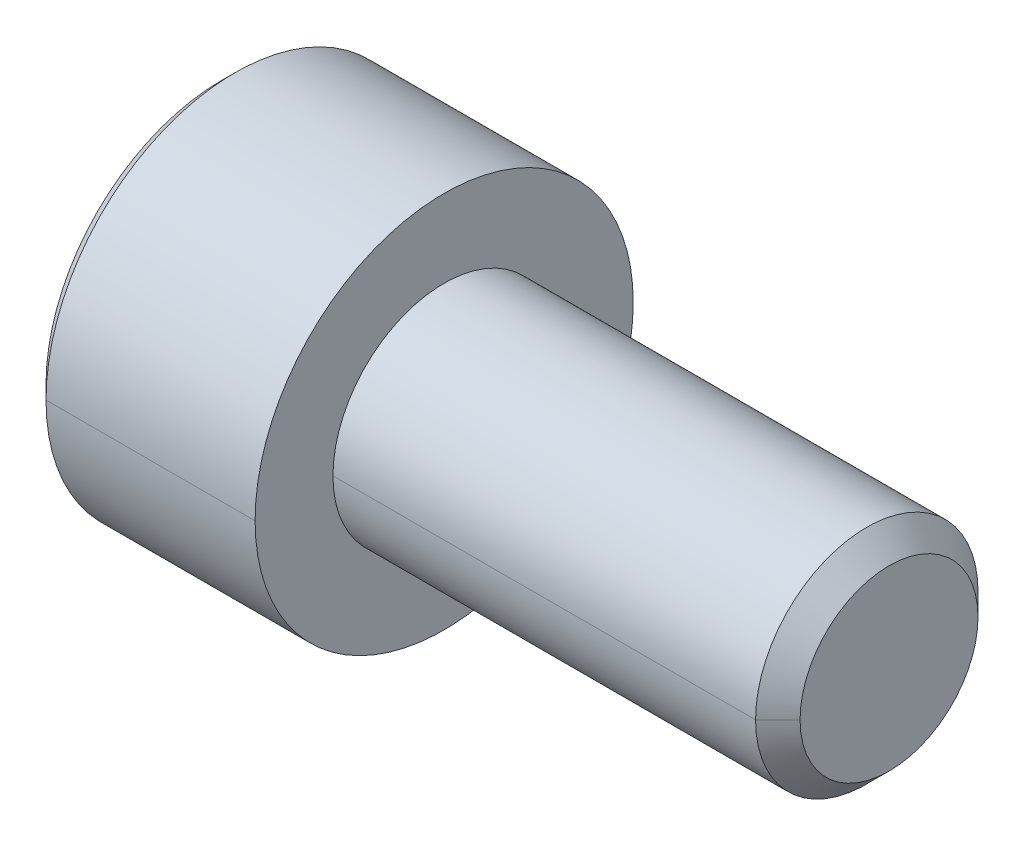
ISO-10303-21;
HEADER;
FILE_DESCRIPTION(('STEP AP214'),'2;1');
FILE_NAME('part.step','',(''),(''),'','','');
FILE_SCHEMA(('AUTOMOTIVE_DESIGN { 1 0 10303 214 1 1 1 1 }'));
ENDSEC;
DATA;
#1=APPLICATION_CONTEXT('core data for automotive mechanical design processes');
#2=APPLICATION_PROTOCOL_DEFINITION('international standard','automotive_design',2000,#1);
#3=PRODUCT_CONTEXT('',#1,'mechanical');
#4=PRODUCT('Part','Part','',(#3));
#5=PRODUCT_RELATED_PRODUCT_CATEGORY('part','',(#4));
#6=PRODUCT_DEFINITION_FORMATION('','',#4);
#7=PRODUCT_DEFINITION_CONTEXT('part definition',#1,'design');
#8=PRODUCT_DEFINITION('design','',#6,#7);
#9=PRODUCT_DEFINITION_SHAPE('','',#8);
#10=(LENGTH_UNIT() NAMED_UNIT(*) SI_UNIT(.MILLI.,.METRE.));
#11=(NAMED_UNIT(*) PLANE_ANGLE_UNIT() SI_UNIT($,.RADIAN.));
#12=(NAMED_UNIT(*) SI_UNIT($,.STERADIAN.) SOLID_ANGLE_UNIT());
#13=UNCERTAINTY_MEASURE_WITH_UNIT(LENGTH_MEASURE(1.E-05),#10,'distance_accuracy_value','');
#14=(GEOMETRIC_REPRESENTATION_CONTEXT(3) GLOBAL_UNCERTAINTY_ASSIGNED_CONTEXT((#13)) GLOBAL_UNIT_ASSIGNED_CONTEXT((#10,
#11,#12)) REPRESENTATION_CONTEXT('',''));
#15=CARTESIAN_POINT('',(0.,0.,0.));
#16=DIRECTION('',(0.,0.,1.));
#17=DIRECTION('',(1.,0.,0.));
#18=AXIS2_PLACEMENT_3D('',#15,#16,#17);
#19=CARTESIAN_POINT('',(-9.2,3.98371685740842,2.3));
#20=DIRECTION('',(0.894427190999916,-0.387298334620742,-0.223606797749979));
#21=DIRECTION('',(0.,0.5,-0.866025403784439));
#22=AXIS2_PLACEMENT_3D('',#19,#20,#21);
#23=PLANE('',#22);
#24=DIRECTION('',(0.397359707119513,0.458831467741124,0.794719414239026));
#25=VECTOR('',#24,1.);
#26=CARTESIAN_POINT('',(-12.5,-1.15470053837925,-2.));
#27=LINE('',#26,#25);
#28=CARTESIAN_POINT('',(-12.5,-1.15470053837925,-2.));
#29=VERTEX_POINT('',#28);
#30=CARTESIAN_POINT('',(-11.5,0.,0.));
#31=VERTEX_POINT('',#30);
#32=EDGE_CURVE('E244',#29,#31,#27,.T.);
#33=ORIENTED_EDGE('',*,*,#32,.F.);
#34=CARTESIAN_POINT('',(-12.5,-1.15470053837925,-2.));
#35=CARTESIAN_POINT('',(-12.5,-1.539600717839,-1.33333333333333));
#36=CARTESIAN_POINT('',(-12.5,-1.92450089729875,-0.666666666666667));
#37=CARTESIAN_POINT('',(-12.5,-2.30940107675851,0.));
#38=(BOUNDED_CURVE() B_SPLINE_CURVE(3,(#34,#35,#36,#37),.UNSPECIFIED.,.F.,
.F.) B_SPLINE_CURVE_WITH_KNOTS((4,4),(0.,1.),
.UNSPECIFIED.) CURVE() GEOMETRIC_REPRESENTATION_ITEM() RATIONAL_B_SPLINE_CURVE((1.,1.,1.,1.)) REPRESENTATION_ITEM(''));
#39=CARTESIAN_POINT('',(-12.5,-2.30940107675851,0.));
#40=VERTEX_POINT('',#39);
#41=EDGE_CURVE('E203',#29,#40,#38,.T.);
#42=ORIENTED_EDGE('',*,*,#41,.T.);
#43=DIRECTION('',(0.397359707119513,0.917662935482247,0.));
#44=VECTOR('',#43,1.);
#45=CARTESIAN_POINT('',(-12.5,-2.30940107675851,0.));
#46=LINE('',#45,#44);
#47=EDGE_CURVE('E10',#40,#31,#46,.T.);
#48=ORIENTED_EDGE('',*,*,#47,.T.);
#49=EDGE_LOOP('',(#33,#42,#48));
#50=FACE_BOUND('',#49,.T.);
#51=ADVANCED_FACE('F16',(#50),#23,.F.);
#52=CARTESIAN_POINT('',(-9.2,3.98371685740842,-2.3));
#53=DIRECTION('',(0.894427190999916,-0.387298334620742,0.223606797749978));
#54=DIRECTION('',(0.,-0.5,-0.866025403784439));
#55=AXIS2_PLACEMENT_3D('',#52,#53,#54);
#56=PLANE('',#55);
#57=ORIENTED_EDGE('',*,*,#47,.F.);
#58=CARTESIAN_POINT('',(-12.5,-2.30940107675851,0.));
#59=CARTESIAN_POINT('',(-12.5,-1.92450089729875,0.666666666666666));
#60=CARTESIAN_POINT('',(-12.5,-1.53960071783901,1.33333333333333));
#61=CARTESIAN_POINT('',(-12.5,-1.15470053837925,2.));
#62=(BOUNDED_CURVE() B_SPLINE_CURVE(3,(#58,#59,#60,#61),.UNSPECIFIED.,.F.,
.F.) B_SPLINE_CURVE_WITH_KNOTS((4,4),(0.,1.),
.UNSPECIFIED.) CURVE() GEOMETRIC_REPRESENTATION_ITEM() RATIONAL_B_SPLINE_CURVE((1.,1.,1.,1.)) REPRESENTATION_ITEM(''));
#63=CARTESIAN_POINT('',(-12.5,-1.15470053837925,2.));
#64=VERTEX_POINT('',#63);
#65=EDGE_CURVE('E204',#40,#64,#62,.T.);
#66=ORIENTED_EDGE('',*,*,#65,.T.);
#67=DIRECTION('',(0.397359707119513,0.458831467741124,-0.794719414239026));
#68=VECTOR('',#67,1.);
#69=CARTESIAN_POINT('',(-12.5,-1.15470053837925,2.));
#70=LINE('',#69,#68);
#71=EDGE_CURVE('E27',#64,#31,#70,.T.);
#72=ORIENTED_EDGE('',*,*,#71,.T.);
#73=EDGE_LOOP('',(#57,#66,#72));
#74=FACE_BOUND('',#73,.T.);
#75=ADVANCED_FACE('F352',(#74),#56,.F.);
#76=CARTESIAN_POINT('',(-9.2,0.,-4.6));
#77=DIRECTION('',(0.894427190999916,0.,0.447213595499958));
#78=DIRECTION('',(0.,-1.,0.));
#79=AXIS2_PLACEMENT_3D('',#76,#77,#78);
#80=PLANE('',#79);
#81=ORIENTED_EDGE('',*,*,#71,.F.);
#82=CARTESIAN_POINT('',(-12.5,-1.15470053837925,2.));
#83=CARTESIAN_POINT('',(-12.5,-0.384900179459752,2.));
#84=CARTESIAN_POINT('',(-12.5,0.38490017945975,2.));
#85=CARTESIAN_POINT('',(-12.5,1.15470053837925,2.));
#86=(BOUNDED_CURVE() B_SPLINE_CURVE(3,(#82,#83,#84,#85),.UNSPECIFIED.,.F.,
.F.) B_SPLINE_CURVE_WITH_KNOTS((4,4),(0.,1.),
.UNSPECIFIED.) CURVE() GEOMETRIC_REPRESENTATION_ITEM() RATIONAL_B_SPLINE_CURVE((1.,1.,1.,1.)) REPRESENTATION_ITEM(''));
#87=CARTESIAN_POINT('',(-12.5,1.15470053837925,2.));
#88=VERTEX_POINT('',#87);
#89=EDGE_CURVE('E230',#64,#88,#86,.T.);
#90=ORIENTED_EDGE('',*,*,#89,.T.);
#91=DIRECTION('',(0.397359707119513,-0.458831467741124,-0.794719414239026));
#92=VECTOR('',#91,1.);
#93=CARTESIAN_POINT('',(-12.5,1.15470053837925,2.));
#94=LINE('',#93,#92);
#95=EDGE_CURVE('E250',#88,#31,#94,.T.);
#96=ORIENTED_EDGE('',*,*,#95,.T.);
#97=EDGE_LOOP('',(#81,#90,#96));
#98=FACE_BOUND('',#97,.T.);
#99=ADVANCED_FACE('F363',(#98),#80,.F.);
#100=CARTESIAN_POINT('',(-9.2,-3.98371685740842,-2.3));
#101=DIRECTION('',(0.894427190999916,0.387298334620742,0.223606797749979));
#102=DIRECTION('',(0.,0.5,-0.866025403784439));
#103=AXIS2_PLACEMENT_3D('',#100,#101,#102);
#104=PLANE('',#103);
#105=ORIENTED_EDGE('',*,*,#95,.F.);
#106=CARTESIAN_POINT('',(-12.5,1.15470053837925,2.));
#107=CARTESIAN_POINT('',(-12.5,1.539600717839,1.33333333333333));
#108=CARTESIAN_POINT('',(-12.5,1.92450089729875,0.666666666666667));
#109=CARTESIAN_POINT('',(-12.5,2.30940107675851,0.));
#110=(BOUNDED_CURVE() B_SPLINE_CURVE(3,(#106,#107,#108,#109),.UNSPECIFIED.,.F.,
.F.) B_SPLINE_CURVE_WITH_KNOTS((4,4),(0.,1.),
.UNSPECIFIED.) CURVE() GEOMETRIC_REPRESENTATION_ITEM() RATIONAL_B_SPLINE_CURVE((1.,1.,1.,1.)) REPRESENTATION_ITEM(''));
#111=CARTESIAN_POINT('',(-12.5,2.30940107675851,0.));
#112=VERTEX_POINT('',#111);
#113=EDGE_CURVE('E198',#88,#112,#110,.T.);
#114=ORIENTED_EDGE('',*,*,#113,.T.);
#115=DIRECTION('',(0.397359707119513,-0.917662935482247,0.));
#116=VECTOR('',#115,1.);
#117=CARTESIAN_POINT('',(-12.5,2.30940107675851,0.));
#118=LINE('',#117,#116);
#119=EDGE_CURVE('E205',#112,#31,#118,.T.);
#120=ORIENTED_EDGE('',*,*,#119,.T.);
#121=EDGE_LOOP('',(#105,#114,#120));
#122=FACE_BOUND('',#121,.T.);
#123=ADVANCED_FACE('F699',(#122),#104,.F.);
#124=CARTESIAN_POINT('',(-9.2,0.,4.6));
#125=DIRECTION('',(0.894427190999916,0.,-0.447213595499958));
#126=DIRECTION('',(0.,-1.,0.));
#127=AXIS2_PLACEMENT_3D('',#124,#125,#126);
#128=PLANE('',#127);
#129=DIRECTION('',(0.397359707119513,-0.458831467741124,0.794719414239026));
#130=VECTOR('',#129,1.);
#131=CARTESIAN_POINT('',(-12.5,1.15470053837925,-2.));
#132=LINE('',#131,#130);
#133=CARTESIAN_POINT('',(-12.5,1.15470053837925,-2.));
#134=VERTEX_POINT('',#133);
#135=EDGE_CURVE('E209',#134,#31,#132,.T.);
#136=ORIENTED_EDGE('',*,*,#135,.F.);
#137=CARTESIAN_POINT('',(-12.5,1.15470053837925,-2.));
#138=CARTESIAN_POINT('',(-12.5,0.384900179459751,-2.));
#139=CARTESIAN_POINT('',(-12.5,-0.384900179459751,-2.));
#140=CARTESIAN_POINT('',(-12.5,-1.15470053837925,-2.));
#141=(BOUNDED_CURVE() B_SPLINE_CURVE(3,(#137,#138,#139,#140),.UNSPECIFIED.,.F.,
.F.) B_SPLINE_CURVE_WITH_KNOTS((4,4),(0.,1.),
.UNSPECIFIED.) CURVE() GEOMETRIC_REPRESENTATION_ITEM() RATIONAL_B_SPLINE_CURVE((1.,1.,1.,1.)) REPRESENTATION_ITEM(''));
#142=EDGE_CURVE('E263',#134,#29,#141,.T.);
#143=ORIENTED_EDGE('',*,*,#142,.T.);
#144=ORIENTED_EDGE('',*,*,#32,.T.);
#145=EDGE_LOOP('',(#136,#143,#144));
#146=FACE_BOUND('',#145,.T.);
#147=ADVANCED_FACE('F694',(#146),#128,.F.);
#148=CARTESIAN_POINT('',(-9.2,-3.98371685740842,2.3));
#149=DIRECTION('',(0.894427190999916,0.387298334620742,-0.223606797749979));
#150=DIRECTION('',(0.,-0.5,-0.866025403784439));
#151=AXIS2_PLACEMENT_3D('',#148,#149,#150);
#152=PLANE('',#151);
#153=ORIENTED_EDGE('',*,*,#119,.F.);
#154=CARTESIAN_POINT('',(-12.5,2.30940107675851,0.));
#155=CARTESIAN_POINT('',(-12.5,1.92450089729875,-0.666666666666667));
#156=CARTESIAN_POINT('',(-12.5,1.539600717839,-1.33333333333333));
#157=CARTESIAN_POINT('',(-12.5,1.15470053837925,-2.));
#158=(BOUNDED_CURVE() B_SPLINE_CURVE(3,(#154,#155,#156,#157),.UNSPECIFIED.,.F.,
.F.) B_SPLINE_CURVE_WITH_KNOTS((4,4),(0.,1.),
.UNSPECIFIED.) CURVE() GEOMETRIC_REPRESENTATION_ITEM() RATIONAL_B_SPLINE_CURVE((1.,1.,1.,1.)) REPRESENTATION_ITEM(''));
#159=EDGE_CURVE('E210',#112,#134,#158,.T.);
#160=ORIENTED_EDGE('',*,*,#159,.T.);
#161=ORIENTED_EDGE('',*,*,#135,.T.);
#162=EDGE_LOOP('',(#153,#160,#161));
#163=FACE_BOUND('',#162,.T.);
#164=ADVANCED_FACE('F698',(#163),#152,.F.);
#165=CARTESIAN_POINT('',(-15.,0.,0.));
#166=DIRECTION('',(1.,0.,0.));
#167=DIRECTION('',(0.,0.,-1.));
#168=AXIS2_PLACEMENT_3D('',#165,#166,#167);
#169=CONICAL_SURFACE('',#168,3.95,0.785398163397446);
#170=DIRECTION('',(0.70710678118655,0.,0.707106781186546));
#171=VECTOR('',#170,1.);
#172=CARTESIAN_POINT('',(-15.,0.,3.95));
#173=LINE('',#172,#171);
#174=CARTESIAN_POINT('',(-15.,0.,3.95));
#175=VERTEX_POINT('',#174);
#176=CARTESIAN_POINT('',(-14.7,0.,4.25));
#177=VERTEX_POINT('',#176);
#178=EDGE_CURVE('E217',#175,#177,#173,.T.);
#179=ORIENTED_EDGE('',*,*,#178,.F.);
#180=CARTESIAN_POINT('',(-15.,0.,0.));
#181=DIRECTION('',(-1.,0.,0.));
#182=DIRECTION('',(0.,0.,-1.));
#183=AXIS2_PLACEMENT_3D('',#180,#181,#182);
#184=CIRCLE('',#183,3.95);
#185=CARTESIAN_POINT('',(-15.,0.,-3.95));
#186=VERTEX_POINT('',#185);
#187=EDGE_CURVE('E191',#186,#175,#184,.T.);
#188=ORIENTED_EDGE('',*,*,#187,.F.);
#189=DIRECTION('',(0.70710678118655,0.,-0.707106781186546));
#190=VECTOR('',#189,1.);
#191=CARTESIAN_POINT('',(-15.,0.,-3.95));
#192=LINE('',#191,#190);
#193=CARTESIAN_POINT('',(-14.7,0.,-4.25));
#194=VERTEX_POINT('',#193);
#195=EDGE_CURVE('E186',#186,#194,#192,.T.);
#196=ORIENTED_EDGE('',*,*,#195,.T.);
#197=CARTESIAN_POINT('',(-14.7,0.,0.));
#198=DIRECTION('',(1.,0.,0.));
#199=DIRECTION('',(0.,0.,-1.));
#200=AXIS2_PLACEMENT_3D('',#197,#198,#199);
#201=CIRCLE('',#200,4.25);
#202=EDGE_CURVE('E118',#177,#194,#201,.T.);
#203=ORIENTED_EDGE('',*,*,#202,.F.);
#204=EDGE_LOOP('',(#179,#188,#196,#203));
#205=FACE_BOUND('',#204,.T.);
#206=ADVANCED_FACE('F609',(#205),#169,.T.);
#207=CARTESIAN_POINT('',(-12.5,2.30940107675851,0.));
#208=DIRECTION('',(0.,0.866025403784439,-0.5));
#209=DIRECTION('',(-1.,0.,0.));
#210=AXIS2_PLACEMENT_3D('',#207,#208,#209);
#211=PLANE('',#210);
#212=DIRECTION('',(0.,-0.5,-0.866025403784439));
#213=VECTOR('',#212,1.);
#214=CARTESIAN_POINT('',(-15.,2.30940107675851,0.));
#215=LINE('',#214,#213);
#216=CARTESIAN_POINT('',(-15.,2.30940107675851,0.));
#217=VERTEX_POINT('',#216);
#218=CARTESIAN_POINT('',(-15.,1.15470053837925,-2.));
#219=VERTEX_POINT('',#218);
#220=EDGE_CURVE('E194',#217,#219,#215,.T.);
#221=ORIENTED_EDGE('',*,*,#220,.T.);
#222=DIRECTION('',(-1.,0.,0.));
#223=VECTOR('',#222,1.);
#224=CARTESIAN_POINT('',(-12.5,1.15470053837925,-2.));
#225=LINE('',#224,#223);
#226=EDGE_CURVE('E238',#134,#219,#225,.T.);
#227=ORIENTED_EDGE('',*,*,#226,.F.);
#228=ORIENTED_EDGE('',*,*,#159,.F.);
#229=DIRECTION('',(-1.,0.,0.));
#230=VECTOR('',#229,1.);
#231=CARTESIAN_POINT('',(-12.5,2.30940107675851,0.));
#232=LINE('',#231,#230);
#233=EDGE_CURVE('E195',#112,#217,#232,.T.);
#234=ORIENTED_EDGE('',*,*,#233,.T.);
#235=EDGE_LOOP('',(#221,#227,#228,#234));
#236=FACE_BOUND('',#235,.T.);
#237=ADVANCED_FACE('F604',(#236),#211,.F.);
#238=CARTESIAN_POINT('',(-12.5,1.15470053837925,-2.));
#239=DIRECTION('',(0.,0.,-1.));
#240=DIRECTION('',(0.,-1.,0.));
#241=AXIS2_PLACEMENT_3D('',#238,#239,#240);
#242=PLANE('',#241);
#243=DIRECTION('',(0.,-1.,0.));
#244=VECTOR('',#243,1.);
#245=CARTESIAN_POINT('',(-15.,1.15470053837925,-2.));
#246=LINE('',#245,#244);
#247=CARTESIAN_POINT('',(-15.,-1.15470053837925,-2.));
#248=VERTEX_POINT('',#247);
#249=EDGE_CURVE('E199',#219,#248,#246,.T.);
#250=ORIENTED_EDGE('',*,*,#249,.T.);
#251=DIRECTION('',(-1.,0.,0.));
#252=VECTOR('',#251,1.);
#253=CARTESIAN_POINT('',(-12.5,-1.15470053837925,-2.));
#254=LINE('',#253,#252);
#255=EDGE_CURVE('E259',#29,#248,#254,.T.);
#256=ORIENTED_EDGE('',*,*,#255,.F.);
#257=ORIENTED_EDGE('',*,*,#142,.F.);
#258=ORIENTED_EDGE('',*,*,#226,.T.);
#259=EDGE_LOOP('',(#250,#256,#257,#258));
#260=FACE_BOUND('',#259,.T.);
#261=ADVANCED_FACE('F608',(#260),#242,.F.);
#262=CARTESIAN_POINT('',(-12.5,-1.15470053837925,-2.));
#263=DIRECTION('',(0.,-0.866025403784439,-0.5));
#264=DIRECTION('',(0.,0.5,-0.866025403784439));
#265=AXIS2_PLACEMENT_3D('',#262,#263,#264);
#266=PLANE('',#265);
#267=DIRECTION('',(0.,-0.5,0.866025403784439));
#268=VECTOR('',#267,1.);
#269=CARTESIAN_POINT('',(-15.,-1.15470053837925,-2.));
#270=LINE('',#269,#268);
#271=CARTESIAN_POINT('',(-15.,-2.30940107675851,0.));
#272=VERTEX_POINT('',#271);
#273=EDGE_CURVE('E215',#248,#272,#270,.T.);
#274=ORIENTED_EDGE('',*,*,#273,.T.);
#275=DIRECTION('',(-1.,0.,0.));
#276=VECTOR('',#275,1.);
#277=CARTESIAN_POINT('',(-12.5,-2.30940107675851,0.));
#278=LINE('',#277,#276);
#279=EDGE_CURVE('E200',#40,#272,#278,.T.);
#280=ORIENTED_EDGE('',*,*,#279,.F.);
#281=ORIENTED_EDGE('',*,*,#41,.F.);
#282=ORIENTED_EDGE('',*,*,#255,.T.);
#283=EDGE_LOOP('',(#274,#280,#281,#282));
#284=FACE_BOUND('',#283,.T.);
#285=ADVANCED_FACE('F597',(#284),#266,.F.);
#286=CARTESIAN_POINT('',(-12.5,-2.30940107675851,0.));
#287=DIRECTION('',(0.,-0.866025403784439,0.5));
#288=DIRECTION('',(-1.,0.,0.));
#289=AXIS2_PLACEMENT_3D('',#286,#287,#288);
#290=PLANE('',#289);
#291=DIRECTION('',(0.,0.5,0.866025403784439));
#292=VECTOR('',#291,1.);
#293=CARTESIAN_POINT('',(-15.,-2.30940107675851,0.));
#294=LINE('',#293,#292);
#295=CARTESIAN_POINT('',(-15.,-1.15470053837925,2.));
#296=VERTEX_POINT('',#295);
#297=EDGE_CURVE('E211',#272,#296,#294,.T.);
#298=ORIENTED_EDGE('',*,*,#297,.T.);
#299=DIRECTION('',(-1.,0.,0.));
#300=VECTOR('',#299,1.);
#301=CARTESIAN_POINT('',(-12.5,-1.15470053837925,2.));
#302=LINE('',#301,#300);
#303=EDGE_CURVE('E227',#64,#296,#302,.T.);
#304=ORIENTED_EDGE('',*,*,#303,.F.);
#305=ORIENTED_EDGE('',*,*,#65,.F.);
#306=ORIENTED_EDGE('',*,*,#279,.T.);
#307=EDGE_LOOP('',(#298,#304,#305,#306));
#308=FACE_BOUND('',#307,.T.);
#309=ADVANCED_FACE('F355',(#308),#290,.F.);
#310=CARTESIAN_POINT('',(-12.5,-1.15470053837925,2.));
#311=DIRECTION('',(0.,0.,1.));
#312=DIRECTION('',(0.,-1.,0.));
#313=AXIS2_PLACEMENT_3D('',#310,#311,#312);
#314=PLANE('',#313);
#315=DIRECTION('',(0.,1.,0.));
#316=VECTOR('',#315,1.);
#317=CARTESIAN_POINT('',(-15.,-1.15470053837925,2.));
#318=LINE('',#317,#316);
#319=CARTESIAN_POINT('',(-15.,1.15470053837925,2.));
#320=VERTEX_POINT('',#319);
#321=EDGE_CURVE('E216',#296,#320,#318,.T.);
#322=ORIENTED_EDGE('',*,*,#321,.T.);
#323=DIRECTION('',(-1.,0.,0.));
#324=VECTOR('',#323,1.);
#325=CARTESIAN_POINT('',(-12.5,1.15470053837925,2.));
#326=LINE('',#325,#324);
#327=EDGE_CURVE('E280',#88,#320,#326,.T.);
#328=ORIENTED_EDGE('',*,*,#327,.F.);
#329=ORIENTED_EDGE('',*,*,#89,.F.);
#330=ORIENTED_EDGE('',*,*,#303,.T.);
#331=EDGE_LOOP('',(#322,#328,#329,#330));
#332=FACE_BOUND('',#331,.T.);
#333=ADVANCED_FACE('F360',(#332),#314,.F.);
#334=CARTESIAN_POINT('',(-12.5,1.15470053837925,2.));
#335=DIRECTION('',(0.,0.866025403784439,0.5));
#336=DIRECTION('',(1.,0.,0.));
#337=AXIS2_PLACEMENT_3D('',#334,#335,#336);
#338=PLANE('',#337);
#339=DIRECTION('',(0.,0.5,-0.866025403784439));
#340=VECTOR('',#339,1.);
#341=CARTESIAN_POINT('',(-15.,1.15470053837925,2.));
#342=LINE('',#341,#340);
#343=EDGE_CURVE('E297',#320,#217,#342,.T.);
#344=ORIENTED_EDGE('',*,*,#343,.T.);
#345=ORIENTED_EDGE('',*,*,#233,.F.);
#346=ORIENTED_EDGE('',*,*,#113,.F.);
#347=ORIENTED_EDGE('',*,*,#327,.T.);
#348=EDGE_LOOP('',(#344,#345,#346,#347));
#349=FACE_BOUND('',#348,.T.);
#350=ADVANCED_FACE('F18',(#349),#338,.F.);
#351=CARTESIAN_POINT('',(-0.5,0.,0.));
#352=DIRECTION('',(-1.,0.,0.));
#353=DIRECTION('',(0.,0.,1.));
#354=AXIS2_PLACEMENT_3D('',#351,#352,#353);
#355=CONICAL_SURFACE('',#354,2.5,0.785398163397448);
#356=DIRECTION('',(-0.707106781186548,0.,-0.707106781186548));
#357=VECTOR('',#356,1.);
#358=CARTESIAN_POINT('',(-0.5,0.,-2.5));
#359=LINE('',#358,#357);
#360=CARTESIAN_POINT('',(0.,0.,-2.));
#361=VERTEX_POINT('',#360);
#362=CARTESIAN_POINT('',(-0.5,0.,-2.5));
#363=VERTEX_POINT('',#362);
#364=EDGE_CURVE('E175',#361,#363,#359,.T.);
#365=ORIENTED_EDGE('',*,*,#364,.F.);
#366=CARTESIAN_POINT('',(0.,0.,0.));
#367=DIRECTION('',(1.,0.,0.));
#368=DIRECTION('',(0.,0.,1.));
#369=AXIS2_PLACEMENT_3D('',#366,#367,#368);
#370=CIRCLE('',#369,2.);
#371=CARTESIAN_POINT('',(0.,0.,2.));
#372=VERTEX_POINT('',#371);
#373=EDGE_CURVE('E98',#372,#361,#370,.T.);
#374=ORIENTED_EDGE('',*,*,#373,.F.);
#375=DIRECTION('',(-0.707106781186548,0.,0.707106781186548));
#376=VECTOR('',#375,1.);
#377=CARTESIAN_POINT('',(-0.5,0.,2.5));
#378=LINE('',#377,#376);
#379=CARTESIAN_POINT('',(-0.5,0.,2.5));
#380=VERTEX_POINT('',#379);
#381=EDGE_CURVE('E167',#372,#380,#378,.T.);
#382=ORIENTED_EDGE('',*,*,#381,.T.);
#383=CARTESIAN_POINT('',(-0.5,0.,0.));
#384=DIRECTION('',(-1.,0.,0.));
#385=DIRECTION('',(0.,0.,1.));
#386=AXIS2_PLACEMENT_3D('',#383,#384,#385);
#387=CIRCLE('',#386,2.5);
#388=EDGE_CURVE('E149',#363,#380,#387,.T.);
#389=ORIENTED_EDGE('',*,*,#388,.F.);
#390=EDGE_LOOP('',(#365,#374,#382,#389));
#391=FACE_BOUND('',#390,.T.);
#392=ADVANCED_FACE('F168',(#391),#355,.T.);
#393=CARTESIAN_POINT('',(-15.,4.25,0.));
#394=DIRECTION('',(1.,0.,0.));
#395=DIRECTION('',(0.,1.,0.));
#396=AXIS2_PLACEMENT_3D('',#393,#394,#395);
#397=PLANE('',#396);
#398=ORIENTED_EDGE('',*,*,#220,.F.);
#399=ORIENTED_EDGE('',*,*,#343,.F.);
#400=ORIENTED_EDGE('',*,*,#321,.F.);
#401=ORIENTED_EDGE('',*,*,#297,.F.);
#402=ORIENTED_EDGE('',*,*,#273,.F.);
#403=ORIENTED_EDGE('',*,*,#249,.F.);
#404=EDGE_LOOP('',(#398,#399,#400,#401,#402,#403));
#405=FACE_BOUND('',#404,.T.);
#406=ORIENTED_EDGE('',*,*,#187,.T.);
#407=CARTESIAN_POINT('',(-15.,0.,0.));
#408=DIRECTION('',(-1.,0.,0.));
#409=DIRECTION('',(0.,0.,-1.));
#410=AXIS2_PLACEMENT_3D('',#407,#408,#409);
#411=CIRCLE('',#410,3.95);
#412=EDGE_CURVE('E221',#175,#186,#411,.T.);
#413=ORIENTED_EDGE('',*,*,#412,.T.);
#414=EDGE_LOOP('',(#406,#413));
#415=FACE_BOUND('',#414,.T.);
#416=ADVANCED_FACE('F621',(#405,#415),#397,.F.);
#417=CARTESIAN_POINT('',(0.,0.,0.));
#418=DIRECTION('',(-1.,0.,0.));
#419=DIRECTION('',(0.,0.,1.));
#420=AXIS2_PLACEMENT_3D('',#417,#418,#419);
#421=CYLINDRICAL_SURFACE('',#420,4.25);
#422=DIRECTION('',(-1.,0.,0.));
#423=VECTOR('',#422,1.);
#424=CARTESIAN_POINT('',(0.,0.,-4.25));
#425=LINE('',#424,#423);
#426=CARTESIAN_POINT('',(-10.,0.,-4.25));
#427=VERTEX_POINT('',#426);
#428=EDGE_CURVE('E226',#427,#194,#425,.T.);
#429=ORIENTED_EDGE('',*,*,#428,.F.);
#430=CARTESIAN_POINT('',(-10.,0.,0.));
#431=DIRECTION('',(-1.,0.,0.));
#432=DIRECTION('',(0.,0.,1.));
#433=AXIS2_PLACEMENT_3D('',#430,#431,#432);
#434=CIRCLE('',#433,4.25);
#435=CARTESIAN_POINT('',(-10.,0.,4.25));
#436=VERTEX_POINT('',#435);
#437=EDGE_CURVE('E140',#427,#436,#434,.T.);
#438=ORIENTED_EDGE('',*,*,#437,.T.);
#439=DIRECTION('',(-1.,0.,0.));
#440=VECTOR('',#439,1.);
#441=CARTESIAN_POINT('',(0.,0.,4.25));
#442=LINE('',#441,#440);
#443=EDGE_CURVE('E223',#436,#177,#442,.T.);
#444=ORIENTED_EDGE('',*,*,#443,.T.);
#445=ORIENTED_EDGE('',*,*,#202,.T.);
#446=EDGE_LOOP('',(#429,#438,#444,#445));
#447=FACE_BOUND('',#446,.T.);
#448=ADVANCED_FACE('F617',(#447),#421,.T.);
#449=CARTESIAN_POINT('',(-10.,2.5,0.));
#450=DIRECTION('',(-1.,0.,0.));
#451=DIRECTION('',(0.,0.,1.));
#452=AXIS2_PLACEMENT_3D('',#449,#450,#451);
#453=PLANE('',#452);
#454=CARTESIAN_POINT('',(-10.,0.,0.));
#455=DIRECTION('',(-1.,0.,0.));
#456=DIRECTION('',(0.,0.,1.));
#457=AXIS2_PLACEMENT_3D('',#454,#455,#456);
#458=CIRCLE('',#457,2.5);
#459=CARTESIAN_POINT('',(-10.,0.,2.5));
#460=VERTEX_POINT('',#459);
#461=CARTESIAN_POINT('',(-10.,0.,-2.5));
#462=VERTEX_POINT('',#461);
#463=EDGE_CURVE('E164',#460,#462,#458,.T.);
#464=ORIENTED_EDGE('',*,*,#463,.T.);
#465=CARTESIAN_POINT('',(-10.,0.,0.));
#466=DIRECTION('',(-1.,0.,0.));
#467=DIRECTION('',(0.,0.,1.));
#468=AXIS2_PLACEMENT_3D('',#465,#466,#467);
#469=CIRCLE('',#468,2.5);
#470=EDGE_CURVE('E158',#462,#460,#469,.T.);
#471=ORIENTED_EDGE('',*,*,#470,.T.);
#472=EDGE_LOOP('',(#464,#471));
#473=FACE_BOUND('',#472,.T.);
#474=CARTESIAN_POINT('',(-10.,0.,0.));
#475=DIRECTION('',(-1.,0.,0.));
#476=DIRECTION('',(0.,0.,1.));
#477=AXIS2_PLACEMENT_3D('',#474,#475,#476);
#478=CIRCLE('',#477,4.25);
#479=EDGE_CURVE('E172',#436,#427,#478,.T.);
#480=ORIENTED_EDGE('',*,*,#479,.F.);
#481=ORIENTED_EDGE('',*,*,#437,.F.);
#482=EDGE_LOOP('',(#480,#481));
#483=FACE_BOUND('',#482,.T.);
#484=ADVANCED_FACE('F577',(#473,#483),#453,.F.);
#485=CARTESIAN_POINT('',(0.,0.,0.));
#486=DIRECTION('',(-1.,0.,0.));
#487=DIRECTION('',(0.,0.,1.));
#488=AXIS2_PLACEMENT_3D('',#485,#486,#487);
#489=CYLINDRICAL_SURFACE('',#488,2.5);
#490=DIRECTION('',(-1.,0.,0.));
#491=VECTOR('',#490,1.);
#492=CARTESIAN_POINT('',(0.,0.,-2.5));
#493=LINE('',#492,#491);
#494=EDGE_CURVE('E155',#363,#462,#493,.T.);
#495=ORIENTED_EDGE('',*,*,#494,.F.);
#496=ORIENTED_EDGE('',*,*,#388,.T.);
#497=DIRECTION('',(-1.,0.,0.));
#498=VECTOR('',#497,1.);
#499=CARTESIAN_POINT('',(0.,0.,2.5));
#500=LINE('',#499,#498);
#501=EDGE_CURVE('E152',#380,#460,#500,.T.);
#502=ORIENTED_EDGE('',*,*,#501,.T.);
#503=ORIENTED_EDGE('',*,*,#470,.F.);
#504=EDGE_LOOP('',(#495,#496,#502,#503));
#505=FACE_BOUND('',#504,.T.);
#506=ADVANCED_FACE('F151',(#505),#489,.T.);
#507=CARTESIAN_POINT('',(0.,0.,0.));
#508=DIRECTION('',(-1.,0.,0.));
#509=DIRECTION('',(0.,0.,1.));
#510=AXIS2_PLACEMENT_3D('',#507,#508,#509);
#511=PLANE('',#510);
#512=ORIENTED_EDGE('',*,*,#373,.T.);
#513=CARTESIAN_POINT('',(0.,0.,0.));
#514=DIRECTION('',(1.,0.,0.));
#515=DIRECTION('',(0.,0.,1.));
#516=AXIS2_PLACEMENT_3D('',#513,#514,#515);
#517=CIRCLE('',#516,2.);
#518=EDGE_CURVE('E181',#361,#372,#517,.T.);
#519=ORIENTED_EDGE('',*,*,#518,.T.);
#520=EDGE_LOOP('',(#512,#519));
#521=FACE_BOUND('',#520,.T.);
#522=ADVANCED_FACE('F576',(#521),#511,.F.);
#523=CARTESIAN_POINT('',(0.,0.,0.));
#524=DIRECTION('',(-1.,0.,0.));
#525=DIRECTION('',(0.,0.,1.));
#526=AXIS2_PLACEMENT_3D('',#523,#524,#525);
#527=CYLINDRICAL_SURFACE('',#526,2.5);
#528=CARTESIAN_POINT('',(-0.5,0.,0.));
#529=DIRECTION('',(-1.,0.,0.));
#530=DIRECTION('',(0.,0.,1.));
#531=AXIS2_PLACEMENT_3D('',#528,#529,#530);
#532=CIRCLE('',#531,2.5);
#533=EDGE_CURVE('E20',#380,#363,#532,.T.);
#534=ORIENTED_EDGE('',*,*,#533,.T.);
#535=ORIENTED_EDGE('',*,*,#494,.T.);
#536=ORIENTED_EDGE('',*,*,#463,.F.);
#537=ORIENTED_EDGE('',*,*,#501,.F.);
#538=EDGE_LOOP('',(#534,#535,#536,#537));
#539=FACE_BOUND('',#538,.T.);
#540=ADVANCED_FACE('F160',(#539),#527,.T.);
#541=CARTESIAN_POINT('',(0.,0.,0.));
#542=DIRECTION('',(-1.,0.,0.));
#543=DIRECTION('',(0.,0.,1.));
#544=AXIS2_PLACEMENT_3D('',#541,#542,#543);
#545=CYLINDRICAL_SURFACE('',#544,4.25);
#546=ORIENTED_EDGE('',*,*,#479,.T.);
#547=ORIENTED_EDGE('',*,*,#428,.T.);
#548=CARTESIAN_POINT('',(-14.7,0.,0.));
#549=DIRECTION('',(1.,0.,0.));
#550=DIRECTION('',(0.,0.,-1.));
#551=AXIS2_PLACEMENT_3D('',#548,#549,#550);
#552=CIRCLE('',#551,4.25);
#553=EDGE_CURVE('E220',#194,#177,#552,.T.);
#554=ORIENTED_EDGE('',*,*,#553,.T.);
#555=ORIENTED_EDGE('',*,*,#443,.F.);
#556=EDGE_LOOP('',(#546,#547,#554,#555));
#557=FACE_BOUND('',#556,.T.);
#558=ADVANCED_FACE('F587',(#557),#545,.T.);
#559=CARTESIAN_POINT('',(-0.5,0.,0.));
#560=DIRECTION('',(-1.,0.,0.));
#561=DIRECTION('',(0.,0.,1.));
#562=AXIS2_PLACEMENT_3D('',#559,#560,#561);
#563=CONICAL_SURFACE('',#562,2.5,0.785398163397448);
#564=ORIENTED_EDGE('',*,*,#518,.F.);
#565=ORIENTED_EDGE('',*,*,#364,.T.);
#566=ORIENTED_EDGE('',*,*,#533,.F.);
#567=ORIENTED_EDGE('',*,*,#381,.F.);
#568=EDGE_LOOP('',(#564,#565,#566,#567));
#569=FACE_BOUND('',#568,.T.);
#570=ADVANCED_FACE('F174',(#569),#563,.T.);
#571=CARTESIAN_POINT('',(-15.,0.,0.));
#572=DIRECTION('',(1.,0.,0.));
#573=DIRECTION('',(0.,0.,-1.));
#574=AXIS2_PLACEMENT_3D('',#571,#572,#573);
#575=CONICAL_SURFACE('',#574,3.95,0.785398163397446);
#576=ORIENTED_EDGE('',*,*,#412,.F.);
#577=ORIENTED_EDGE('',*,*,#178,.T.);
#578=ORIENTED_EDGE('',*,*,#553,.F.);
#579=ORIENTED_EDGE('',*,*,#195,.F.);
#580=EDGE_LOOP('',(#576,#577,#578,#579));
#581=FACE_BOUND('',#580,.T.);
#582=ADVANCED_FACE('F764',(#581),#575,.T.);
#583=CLOSED_SHELL('',(#51,#75,#99,#123,#147,#164,#206,#237,#261,#285,#309,#333,#350,#392,#416,
#448,#484,#506,#522,#540,#558,#570,#582));
#584=MANIFOLD_SOLID_BREP('B1',#583);
#585=ADVANCED_BREP_SHAPE_REPRESENTATION('',(#18,#584),#14);
#586=SHAPE_DEFINITION_REPRESENTATION(#9,#585);
ENDSEC;
END-ISO-10303-21;
